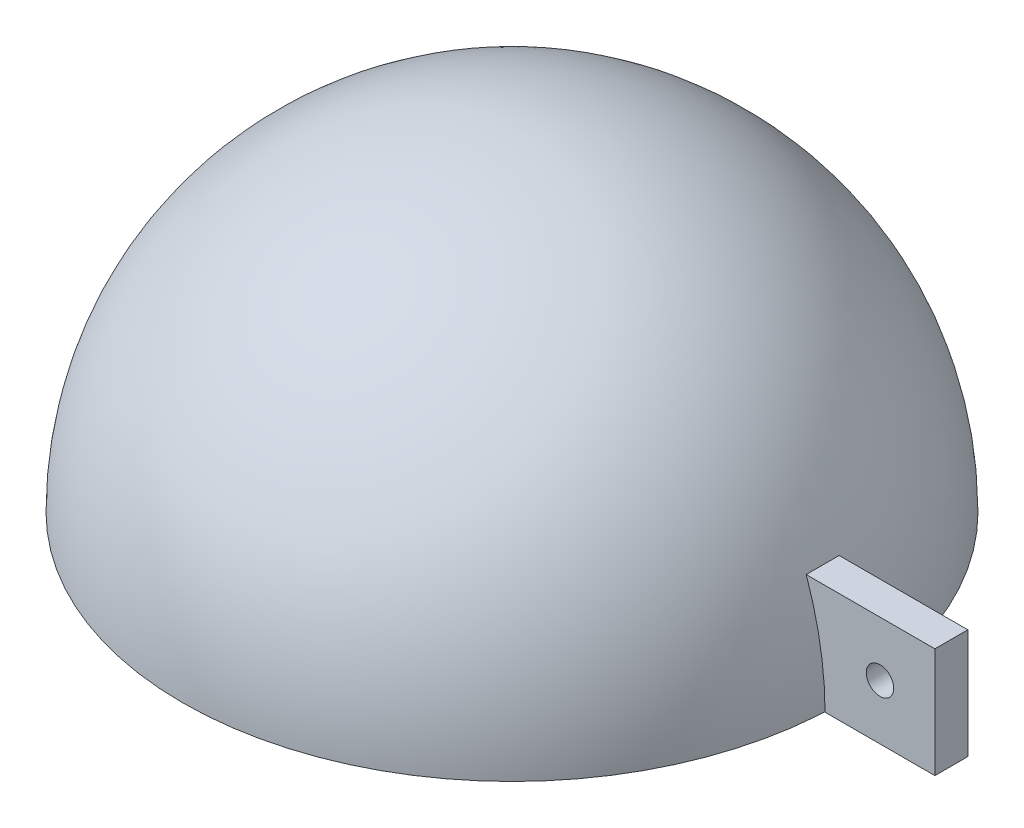
ISO-10303-21;
HEADER;
FILE_DESCRIPTION(('STEP AP214'),'2;1');
FILE_NAME('part.step','',(''),(''),'','','');
FILE_SCHEMA(('AUTOMOTIVE_DESIGN { 1 0 10303 214 1 1 1 1 }'));
ENDSEC;
DATA;
#1=APPLICATION_CONTEXT('core data for automotive mechanical design processes');
#2=APPLICATION_PROTOCOL_DEFINITION('international standard','automotive_design',2000,#1);
#3=PRODUCT_CONTEXT('',#1,'mechanical');
#4=PRODUCT('Part','Part','',(#3));
#5=PRODUCT_RELATED_PRODUCT_CATEGORY('part','',(#4));
#6=PRODUCT_DEFINITION_FORMATION('','',#4);
#7=PRODUCT_DEFINITION_CONTEXT('part definition',#1,'design');
#8=PRODUCT_DEFINITION('design','',#6,#7);
#9=PRODUCT_DEFINITION_SHAPE('','',#8);
#10=(LENGTH_UNIT() NAMED_UNIT(*) SI_UNIT(.MILLI.,.METRE.));
#11=(NAMED_UNIT(*) PLANE_ANGLE_UNIT() SI_UNIT($,.RADIAN.));
#12=(NAMED_UNIT(*) SI_UNIT($,.STERADIAN.) SOLID_ANGLE_UNIT());
#13=UNCERTAINTY_MEASURE_WITH_UNIT(LENGTH_MEASURE(1.E-05),#10,'distance_accuracy_value','');
#14=(GEOMETRIC_REPRESENTATION_CONTEXT(3) GLOBAL_UNCERTAINTY_ASSIGNED_CONTEXT((#13)) GLOBAL_UNIT_ASSIGNED_CONTEXT((#10,
#11,#12)) REPRESENTATION_CONTEXT('',''));
#15=CARTESIAN_POINT('',(0.,0.,0.));
#16=DIRECTION('',(0.,0.,1.));
#17=DIRECTION('',(1.,0.,0.));
#18=AXIS2_PLACEMENT_3D('',#15,#16,#17);
#19=CARTESIAN_POINT('',(-2.35922392732846E-13,0.,1.5));
#20=DIRECTION('',(0.,0.,-1.));
#21=DIRECTION('',(-1.,0.,0.));
#22=AXIS2_PLACEMENT_3D('',#19,#20,#21);
#23=CYLINDRICAL_SURFACE('',#22,30.0000000000002);
#24=CARTESIAN_POINT('',(-2.35922392732846E-13,0.,-1.5));
#25=DIRECTION('',(0.,0.,-1.));
#26=DIRECTION('',(1.,0.,0.));
#27=AXIS2_PLACEMENT_3D('',#24,#25,#26);
#28=CIRCLE('',#27,30.0000000000002);
#29=CARTESIAN_POINT('',(28.2842712474619,10.,-1.5));
#30=VERTEX_POINT('',#29);
#31=CARTESIAN_POINT('',(30.,0.,-1.5));
#32=VERTEX_POINT('',#31);
#33=EDGE_CURVE('E106',#30,#32,#28,.T.);
#34=ORIENTED_EDGE('',*,*,#33,.T.);
#35=DIRECTION('',(0.,0.,-1.));
#36=VECTOR('',#35,1.);
#37=CARTESIAN_POINT('',(30.,0.,1.5));
#38=LINE('',#37,#36);
#39=CARTESIAN_POINT('',(30.,0.,1.5));
#40=VERTEX_POINT('',#39);
#41=EDGE_CURVE('E12',#40,#32,#38,.T.);
#42=ORIENTED_EDGE('',*,*,#41,.F.);
#43=CARTESIAN_POINT('',(-2.35922392732846E-13,0.,1.5));
#44=DIRECTION('',(0.,0.,-1.));
#45=DIRECTION('',(1.,0.,0.));
#46=AXIS2_PLACEMENT_3D('',#43,#44,#45);
#47=CIRCLE('',#46,30.0000000000002);
#48=CARTESIAN_POINT('',(28.2842712474619,10.,1.5));
#49=VERTEX_POINT('',#48);
#50=EDGE_CURVE('E94',#49,#40,#47,.T.);
#51=ORIENTED_EDGE('',*,*,#50,.F.);
#52=DIRECTION('',(0.,0.,-1.));
#53=VECTOR('',#52,1.);
#54=CARTESIAN_POINT('',(28.2842712474619,10.,1.5));
#55=LINE('',#54,#53);
#56=EDGE_CURVE('E102',#49,#30,#55,.T.);
#57=ORIENTED_EDGE('',*,*,#56,.T.);
#58=EDGE_LOOP('',(#34,#42,#51,#57));
#59=FACE_BOUND('',#58,.T.);
#60=ADVANCED_FACE('F43',(#59),#23,.F.);
#61=CARTESIAN_POINT('',(30.,0.,1.5));
#62=DIRECTION('',(0.,1.,0.));
#63=DIRECTION('',(-1.,0.,0.));
#64=AXIS2_PLACEMENT_3D('',#61,#62,#63);
#65=PLANE('',#64);
#66=DIRECTION('',(1.,0.,0.));
#67=VECTOR('',#66,1.);
#68=CARTESIAN_POINT('',(30.,0.,-1.5));
#69=LINE('',#68,#67);
#70=CARTESIAN_POINT('',(40.,0.,-1.5));
#71=VERTEX_POINT('',#70);
#72=EDGE_CURVE('E98',#32,#71,#69,.T.);
#73=ORIENTED_EDGE('',*,*,#72,.T.);
#74=DIRECTION('',(0.,0.,-1.));
#75=VECTOR('',#74,1.);
#76=CARTESIAN_POINT('',(40.,0.,1.5));
#77=LINE('',#76,#75);
#78=CARTESIAN_POINT('',(40.,0.,1.5));
#79=VERTEX_POINT('',#78);
#80=EDGE_CURVE('E51',#79,#71,#77,.T.);
#81=ORIENTED_EDGE('',*,*,#80,.F.);
#82=DIRECTION('',(1.,0.,0.));
#83=VECTOR('',#82,1.);
#84=CARTESIAN_POINT('',(30.,0.,1.5));
#85=LINE('',#84,#83);
#86=EDGE_CURVE('E89',#40,#79,#85,.T.);
#87=ORIENTED_EDGE('',*,*,#86,.F.);
#88=ORIENTED_EDGE('',*,*,#41,.T.);
#89=EDGE_LOOP('',(#73,#81,#87,#88));
#90=FACE_BOUND('',#89,.T.);
#91=ADVANCED_FACE('F97',(#90),#65,.F.);
#92=CARTESIAN_POINT('',(40.,0.,1.5));
#93=DIRECTION('',(-1.,0.,0.));
#94=DIRECTION('',(0.,0.,1.));
#95=AXIS2_PLACEMENT_3D('',#92,#93,#94);
#96=PLANE('',#95);
#97=DIRECTION('',(0.,1.,0.));
#98=VECTOR('',#97,1.);
#99=CARTESIAN_POINT('',(40.,0.,-1.5));
#100=LINE('',#99,#98);
#101=CARTESIAN_POINT('',(40.,10.,-1.5));
#102=VERTEX_POINT('',#101);
#103=EDGE_CURVE('E76',#71,#102,#100,.T.);
#104=ORIENTED_EDGE('',*,*,#103,.T.);
#105=DIRECTION('',(0.,0.,-1.));
#106=VECTOR('',#105,1.);
#107=CARTESIAN_POINT('',(40.,10.,1.5));
#108=LINE('',#107,#106);
#109=CARTESIAN_POINT('',(40.,10.,1.5));
#110=VERTEX_POINT('',#109);
#111=EDGE_CURVE('E99',#110,#102,#108,.T.);
#112=ORIENTED_EDGE('',*,*,#111,.F.);
#113=DIRECTION('',(0.,1.,0.));
#114=VECTOR('',#113,1.);
#115=CARTESIAN_POINT('',(40.,0.,1.5));
#116=LINE('',#115,#114);
#117=EDGE_CURVE('E92',#79,#110,#116,.T.);
#118=ORIENTED_EDGE('',*,*,#117,.F.);
#119=ORIENTED_EDGE('',*,*,#80,.T.);
#120=EDGE_LOOP('',(#104,#112,#118,#119));
#121=FACE_BOUND('',#120,.T.);
#122=ADVANCED_FACE('F100',(#121),#96,.F.);
#123=CARTESIAN_POINT('',(40.,10.,1.5));
#124=DIRECTION('',(0.,-1.,0.));
#125=DIRECTION('',(1.,0.,0.));
#126=AXIS2_PLACEMENT_3D('',#123,#124,#125);
#127=PLANE('',#126);
#128=DIRECTION('',(-1.,0.,0.));
#129=VECTOR('',#128,1.);
#130=CARTESIAN_POINT('',(40.,10.,-1.5));
#131=LINE('',#130,#129);
#132=EDGE_CURVE('E82',#102,#30,#131,.T.);
#133=ORIENTED_EDGE('',*,*,#132,.T.);
#134=ORIENTED_EDGE('',*,*,#56,.F.);
#135=DIRECTION('',(-1.,0.,0.));
#136=VECTOR('',#135,1.);
#137=CARTESIAN_POINT('',(40.,10.,1.5));
#138=LINE('',#137,#136);
#139=EDGE_CURVE('E59',#110,#49,#138,.T.);
#140=ORIENTED_EDGE('',*,*,#139,.F.);
#141=ORIENTED_EDGE('',*,*,#111,.T.);
#142=EDGE_LOOP('',(#133,#134,#140,#141));
#143=FACE_BOUND('',#142,.T.);
#144=ADVANCED_FACE('F114',(#143),#127,.F.);
#145=CARTESIAN_POINT('',(-2.35922392732846E-13,0.,1.5));
#146=DIRECTION('',(0.,0.,1.));
#147=DIRECTION('',(1.,0.,0.));
#148=AXIS2_PLACEMENT_3D('',#145,#146,#147);
#149=PLANE('',#148);
#150=CARTESIAN_POINT('',(35.,5.,1.5));
#151=DIRECTION('',(0.,0.,1.));
#152=DIRECTION('',(1.,0.,0.));
#153=AXIS2_PLACEMENT_3D('',#150,#151,#152);
#154=CIRCLE('',#153,1.24999999999999);
#155=CARTESIAN_POINT('',(36.25,5.,1.5));
#156=VERTEX_POINT('',#155);
#157=EDGE_CURVE('E122',#156,#156,#154,.T.);
#158=ORIENTED_EDGE('',*,*,#157,.F.);
#159=EDGE_LOOP('',(#158));
#160=FACE_BOUND('',#159,.T.);
#161=ORIENTED_EDGE('',*,*,#50,.T.);
#162=ORIENTED_EDGE('',*,*,#86,.T.);
#163=ORIENTED_EDGE('',*,*,#117,.T.);
#164=ORIENTED_EDGE('',*,*,#139,.T.);
#165=EDGE_LOOP('',(#161,#162,#163,#164));
#166=FACE_BOUND('',#165,.T.);
#167=ADVANCED_FACE('F90',(#160,#166),#149,.T.);
#168=CARTESIAN_POINT('',(-2.35922392732846E-13,0.,-1.5));
#169=DIRECTION('',(0.,0.,1.));
#170=DIRECTION('',(1.,0.,0.));
#171=AXIS2_PLACEMENT_3D('',#168,#169,#170);
#172=PLANE('',#171);
#173=CARTESIAN_POINT('',(35.,5.,-1.5));
#174=DIRECTION('',(0.,0.,1.));
#175=DIRECTION('',(1.,0.,0.));
#176=AXIS2_PLACEMENT_3D('',#173,#174,#175);
#177=CIRCLE('',#176,1.24999999999999);
#178=CARTESIAN_POINT('',(36.25,5.,-1.5));
#179=VERTEX_POINT('',#178);
#180=EDGE_CURVE('E109',#179,#179,#177,.T.);
#181=ORIENTED_EDGE('',*,*,#180,.T.);
#182=EDGE_LOOP('',(#181));
#183=FACE_BOUND('',#182,.T.);
#184=ORIENTED_EDGE('',*,*,#33,.F.);
#185=ORIENTED_EDGE('',*,*,#132,.F.);
#186=ORIENTED_EDGE('',*,*,#103,.F.);
#187=ORIENTED_EDGE('',*,*,#72,.F.);
#188=EDGE_LOOP('',(#184,#185,#186,#187));
#189=FACE_BOUND('',#188,.T.);
#190=ADVANCED_FACE('F117',(#183,#189),#172,.F.);
#191=CARTESIAN_POINT('',(35.,5.,1.5));
#192=DIRECTION('',(0.,0.,1.));
#193=DIRECTION('',(1.,0.,0.));
#194=AXIS2_PLACEMENT_3D('',#191,#192,#193);
#195=CYLINDRICAL_SURFACE('',#194,1.24999999999999);
#196=ORIENTED_EDGE('',*,*,#157,.T.);
#197=EDGE_LOOP('',(#196));
#198=FACE_BOUND('',#197,.T.);
#199=ORIENTED_EDGE('',*,*,#180,.F.);
#200=EDGE_LOOP('',(#199));
#201=FACE_BOUND('',#200,.T.);
#202=ADVANCED_FACE('F126',(#198,#201),#195,.F.);
#203=CLOSED_SHELL('',(#60,#91,#122,#144,#167,#190,#202));
#204=MANIFOLD_SOLID_BREP('B2',#203);
#205=CARTESIAN_POINT('',(0.,0.,0.));
#206=DIRECTION('',(0.,-1.,0.));
#207=DIRECTION('',(0.,0.,-1.));
#208=AXIS2_PLACEMENT_3D('',#205,#206,#207);
#209=PLANE('',#208);
#210=CARTESIAN_POINT('',(0.,0.,0.));
#211=DIRECTION('',(0.,-1.,0.));
#212=DIRECTION('',(0.,0.,-1.));
#213=AXIS2_PLACEMENT_3D('',#210,#211,#212);
#214=CIRCLE('',#213,27.);
#215=CARTESIAN_POINT('',(0.,0.,-27.));
#216=VERTEX_POINT('',#215);
#217=EDGE_CURVE('E195',#216,#216,#214,.T.);
#218=ORIENTED_EDGE('',*,*,#217,.F.);
#219=EDGE_LOOP('',(#218));
#220=FACE_BOUND('',#219,.T.);
#221=CARTESIAN_POINT('',(0.,0.,0.));
#222=DIRECTION('',(0.,-1.,0.));
#223=DIRECTION('',(0.,0.,-1.));
#224=AXIS2_PLACEMENT_3D('',#221,#222,#223);
#225=CIRCLE('',#224,30.);
#226=CARTESIAN_POINT('',(0.,0.,-30.));
#227=VERTEX_POINT('',#226);
#228=EDGE_CURVE('E42',#227,#227,#225,.T.);
#229=ORIENTED_EDGE('',*,*,#228,.T.);
#230=EDGE_LOOP('',(#229));
#231=FACE_BOUND('',#230,.T.);
#232=ADVANCED_FACE('F189',(#220,#231),#209,.T.);
#233=CARTESIAN_POINT('',(0.,0.,0.));
#234=DIRECTION('',(0.,-1.,0.));
#235=DIRECTION('',(1.,0.,0.));
#236=AXIS2_PLACEMENT_3D('',#233,#234,#235);
#237=SPHERICAL_SURFACE('',#236,30.);
#238=ORIENTED_EDGE('',*,*,#228,.F.);
#239=EDGE_LOOP('',(#238));
#240=FACE_BOUND('',#239,.T.);
#241=ADVANCED_FACE('F204',(#240),#237,.T.);
#242=CARTESIAN_POINT('',(0.,0.,0.));
#243=DIRECTION('',(0.,-1.,0.));
#244=DIRECTION('',(1.,0.,0.));
#245=AXIS2_PLACEMENT_3D('',#242,#243,#244);
#246=SPHERICAL_SURFACE('',#245,27.);
#247=ORIENTED_EDGE('',*,*,#217,.T.);
#248=EDGE_LOOP('',(#247));
#249=FACE_BOUND('',#248,.T.);
#250=ADVANCED_FACE('F201',(#249),#246,.F.);
#251=CLOSED_SHELL('',(#232,#241,#250));
#252=MANIFOLD_SOLID_BREP('B6',#251);
#253=ADVANCED_BREP_SHAPE_REPRESENTATION('',(#18,#204,#252),#14);
#254=SHAPE_DEFINITION_REPRESENTATION(#9,#253);
ENDSEC;
END-ISO-10303-21;
